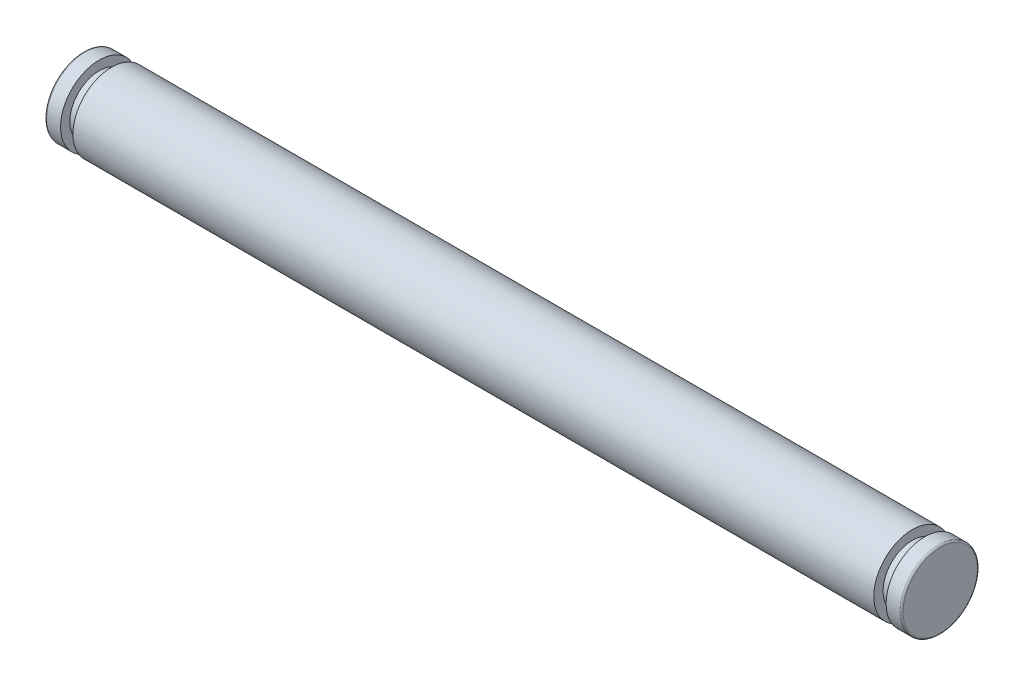
ISO-10303-21;
HEADER;
FILE_DESCRIPTION(('STEP AP214'),'2;1');
FILE_NAME('part.step','',(''),(''),'','','');
FILE_SCHEMA(('AUTOMOTIVE_DESIGN { 1 0 10303 214 1 1 1 1 }'));
ENDSEC;
DATA;
#1=APPLICATION_CONTEXT('core data for automotive mechanical design processes');
#2=APPLICATION_PROTOCOL_DEFINITION('international standard','automotive_design',2000,#1);
#3=PRODUCT_CONTEXT('',#1,'mechanical');
#4=PRODUCT('Part','Part','',(#3));
#5=PRODUCT_RELATED_PRODUCT_CATEGORY('part','',(#4));
#6=PRODUCT_DEFINITION_FORMATION('','',#4);
#7=PRODUCT_DEFINITION_CONTEXT('part definition',#1,'design');
#8=PRODUCT_DEFINITION('design','',#6,#7);
#9=PRODUCT_DEFINITION_SHAPE('','',#8);
#10=(LENGTH_UNIT() NAMED_UNIT(*) SI_UNIT(.MILLI.,.METRE.));
#11=(NAMED_UNIT(*) PLANE_ANGLE_UNIT() SI_UNIT($,.RADIAN.));
#12=(NAMED_UNIT(*) SI_UNIT($,.STERADIAN.) SOLID_ANGLE_UNIT());
#13=UNCERTAINTY_MEASURE_WITH_UNIT(LENGTH_MEASURE(1.E-05),#10,'distance_accuracy_value','');
#14=(GEOMETRIC_REPRESENTATION_CONTEXT(3) GLOBAL_UNCERTAINTY_ASSIGNED_CONTEXT((#13)) GLOBAL_UNIT_ASSIGNED_CONTEXT((#10,
#11,#12)) REPRESENTATION_CONTEXT('',''));
#15=CARTESIAN_POINT('',(0.,0.,0.));
#16=DIRECTION('',(0.,0.,1.));
#17=DIRECTION('',(1.,0.,0.));
#18=AXIS2_PLACEMENT_3D('',#15,#16,#17);
#19=CARTESIAN_POINT('',(0.,-1.542288,1.542288));
#20=DIRECTION('',(1.,0.,0.));
#21=DIRECTION('',(0.,0.,-1.));
#22=AXIS2_PLACEMENT_3D('',#19,#20,#21);
#23=PLANE('',#22);
#24=CARTESIAN_POINT('',(4.05862416325985E-10,0.,-1.52399999998335));
#25=CARTESIAN_POINT('',(4.05862415753623E-10,3.04799999996697,-1.52399999998335));
#26=CARTESIAN_POINT('',(4.05862415753623E-10,3.04799999996697,1.52399999998335));
#27=CARTESIAN_POINT('',(4.05862416325985E-10,0.,1.52399999998335));
#28=(BOUNDED_CURVE() B_SPLINE_CURVE(3,(#24,#25,#26,#27),.UNSPECIFIED.,.F.,
.F.) B_SPLINE_CURVE_WITH_KNOTS((4,4),(0.,1.),
.UNSPECIFIED.) CURVE() GEOMETRIC_REPRESENTATION_ITEM() RATIONAL_B_SPLINE_CURVE((0.956578302156102,
0.318859434052034,0.318859434052034,0.956578302156102)) REPRESENTATION_ITEM(''));
#29=CARTESIAN_POINT('',(2.43517449856769E-10,0.,-1.52399999968733));
#30=VERTEX_POINT('',#29);
#31=CARTESIAN_POINT('',(2.43517449856769E-10,0.,1.52399999968733));
#32=VERTEX_POINT('',#31);
#33=EDGE_CURVE('E55',#30,#32,#28,.T.);
#34=ORIENTED_EDGE('',*,*,#33,.F.);
#35=CARTESIAN_POINT('',(4.05862416363426E-10,0.,1.52399999998335));
#36=CARTESIAN_POINT('',(4.05862415812031E-10,-3.04799999996697,1.52399999998335));
#37=CARTESIAN_POINT('',(4.05862415812031E-10,-3.04799999996697,-1.52399999998335));
#38=CARTESIAN_POINT('',(4.05862416363426E-10,0.,-1.52399999998335));
#39=(BOUNDED_CURVE() B_SPLINE_CURVE(3,(#35,#36,#37,#38),.UNSPECIFIED.,.F.,
.F.) B_SPLINE_CURVE_WITH_KNOTS((4,4),(0.,1.),
.UNSPECIFIED.) CURVE() GEOMETRIC_REPRESENTATION_ITEM() RATIONAL_B_SPLINE_CURVE((0.956578302156103,
0.318859434052034,0.318859434052034,0.956578302156103)) REPRESENTATION_ITEM(''));
#40=EDGE_CURVE('E61',#32,#30,#39,.T.);
#41=ORIENTED_EDGE('',*,*,#40,.F.);
#42=EDGE_LOOP('',(#34,#41));
#43=FACE_BOUND('',#42,.T.);
#44=ADVANCED_FACE('F17',(#43),#23,.F.);
#45=CARTESIAN_POINT('',(0.069839422,0.,-1.587182764));
#46=CARTESIAN_POINT('',(0.069839422,3.174365529,-1.587182764));
#47=CARTESIAN_POINT('',(0.069839422,3.174365529,1.587182764));
#48=CARTESIAN_POINT('',(0.069839422,0.,1.587182764));
#49=CARTESIAN_POINT('',(0.026666586,0.,-1.591514497));
#50=CARTESIAN_POINT('',(0.026666586,3.183028994,-1.591514497));
#51=CARTESIAN_POINT('',(0.026666586,3.183028994,1.591514497));
#52=CARTESIAN_POINT('',(0.026666586,0.,1.591514497));
#53=CARTESIAN_POINT('',(-0.004014497,0.,-1.560833414));
#54=CARTESIAN_POINT('',(-0.004014497,3.121666828,-1.560833414));
#55=CARTESIAN_POINT('',(-0.004014497,3.121666828,1.560833414));
#56=CARTESIAN_POINT('',(-0.004014497,0.,1.560833414));
#57=CARTESIAN_POINT('',(0.000317236,0.,-1.517660578));
#58=CARTESIAN_POINT('',(0.000317236,3.035321156,-1.517660578));
#59=CARTESIAN_POINT('',(0.000317236,3.035321156,1.517660578));
#60=CARTESIAN_POINT('',(0.000317236,0.,1.517660578));
#61=(BOUNDED_SURFACE() B_SPLINE_SURFACE(3,3,((#45,#46,#47,#48),(#49,#50,#51,#52),(#53,#54,#55,
#56),(#57,#58,#59,#60)),.UNSPECIFIED.,.F.,.F.,.F.) B_SPLINE_SURFACE_WITH_KNOTS((4,4),(4,4),(0.,
1.),(0.,1.),.UNSPECIFIED.) GEOMETRIC_REPRESENTATION_ITEM() RATIONAL_B_SPLINE_SURFACE(((1.,
0.333333333333333,0.333333333333333,1.),(0.755320871117972,0.251773623705991,0.251773623705991,
0.755320871117972),(0.755320871117972,0.251773623705991,0.251773623705991,0.755320871117972),
(1.,0.333333333333333,0.333333333333333,1.))) REPRESENTATION_ITEM('') SURFACE());
#62=CARTESIAN_POINT('',(0.0635000000000011,0.,0.));
#63=DIRECTION('',(-1.,0.,0.));
#64=DIRECTION('',(0.,0.,1.));
#65=AXIS2_PLACEMENT_3D('',#62,#63,#64);
#66=CIRCLE('',#65,1.5875);
#67=CARTESIAN_POINT('',(0.0635000000045585,-1.42547385130614E-10,1.58749999989853));
#68=VERTEX_POINT('',#67);
#69=CARTESIAN_POINT('',(0.0635000000045585,-4.88402539152132E-10,-1.58749999989853));
#70=VERTEX_POINT('',#69);
#71=EDGE_CURVE('E71',#68,#70,#66,.T.);
#72=CARTESIAN_POINT('',(0.069839422,0.,-1.587182764));
#73=CARTESIAN_POINT('',(0.026666586,0.,-1.591514497));
#74=CARTESIAN_POINT('',(-0.004014497,0.,-1.560833414));
#75=CARTESIAN_POINT('',(0.000317236,0.,-1.517660578));
#76=(BOUNDED_CURVE() B_SPLINE_CURVE(3,(#72,#73,#74,#75),.UNSPECIFIED.,.F.,
.F.) B_SPLINE_CURVE_WITH_KNOTS((4,4),(0.,1.),
.UNSPECIFIED.) CURVE() GEOMETRIC_REPRESENTATION_ITEM() RATIONAL_B_SPLINE_CURVE((1.,
0.755320871117972,0.755320871117972,1.)) REPRESENTATION_ITEM(''));
#77=EDGE_CURVE('E68',#30,#70,#76,.F.);
#78=CARTESIAN_POINT('',(0.069839422,0.,1.587182764));
#79=CARTESIAN_POINT('',(0.026666586,0.,1.591514497));
#80=CARTESIAN_POINT('',(-0.004014497,0.,1.560833414));
#81=CARTESIAN_POINT('',(0.000317236,0.,1.517660578));
#82=(BOUNDED_CURVE() B_SPLINE_CURVE(3,(#78,#79,#80,#81),.UNSPECIFIED.,.F.,
.F.) B_SPLINE_CURVE_WITH_KNOTS((4,4),(0.,1.),
.UNSPECIFIED.) CURVE() GEOMETRIC_REPRESENTATION_ITEM() RATIONAL_B_SPLINE_CURVE((1.,
0.755320871117972,0.755320871117972,1.)) REPRESENTATION_ITEM(''));
#83=EDGE_CURVE('E64',#68,#32,#82,.T.);
#84=ORIENTED_EDGE('',*,*,#71,.T.);
#85=ORIENTED_EDGE('',*,*,#77,.F.);
#86=ORIENTED_EDGE('',*,*,#33,.T.);
#87=ORIENTED_EDGE('',*,*,#83,.F.);
#88=EDGE_LOOP('',(#84,#85,#86,#87));
#89=FACE_BOUND('',#88,.T.);
#90=ADVANCED_FACE('F69',(#89),#61,.T.);
#91=CARTESIAN_POINT('',(0.069839422,0.,1.587182764));
#92=CARTESIAN_POINT('',(0.069839422,-3.174365529,1.587182764));
#93=CARTESIAN_POINT('',(0.069839422,-3.174365529,-1.587182764));
#94=CARTESIAN_POINT('',(0.069839422,0.,-1.587182764));
#95=CARTESIAN_POINT('',(0.026666586,0.,1.591514497));
#96=CARTESIAN_POINT('',(0.026666586,-3.183028994,1.591514497));
#97=CARTESIAN_POINT('',(0.026666586,-3.183028994,-1.591514497));
#98=CARTESIAN_POINT('',(0.026666586,0.,-1.591514497));
#99=CARTESIAN_POINT('',(-0.004014497,0.,1.560833414));
#100=CARTESIAN_POINT('',(-0.004014497,-3.121666828,1.560833414));
#101=CARTESIAN_POINT('',(-0.004014497,-3.121666828,-1.560833414));
#102=CARTESIAN_POINT('',(-0.004014497,0.,-1.560833414));
#103=CARTESIAN_POINT('',(0.000317236,0.,1.517660578));
#104=CARTESIAN_POINT('',(0.000317236,-3.035321156,1.517660578));
#105=CARTESIAN_POINT('',(0.000317236,-3.035321156,-1.517660578));
#106=CARTESIAN_POINT('',(0.000317236,0.,-1.517660578));
#107=(BOUNDED_SURFACE() B_SPLINE_SURFACE(3,3,((#91,#92,#93,#94),(#95,#96,#97,#98),(#99,#100,
#101,#102),(#103,#104,#105,#106)),.UNSPECIFIED.,.F.,.F.,.F.) B_SPLINE_SURFACE_WITH_KNOTS((4,4),
(4,4),(0.,1.),(0.,1.),
.UNSPECIFIED.) GEOMETRIC_REPRESENTATION_ITEM() RATIONAL_B_SPLINE_SURFACE(((1.,0.333333333333333,
0.333333333333333,1.),(0.755320871117972,0.251773623705991,0.251773623705991,0.755320871117972),
(0.755320871117972,0.251773623705991,0.251773623705991,0.755320871117972),(1.,0.333333333333333,
0.333333333333333,1.))) REPRESENTATION_ITEM('') SURFACE());
#108=CARTESIAN_POINT('',(0.0635000000000011,0.,0.));
#109=DIRECTION('',(-1.,0.,0.));
#110=DIRECTION('',(0.,0.,1.));
#111=AXIS2_PLACEMENT_3D('',#108,#109,#110);
#112=CIRCLE('',#111,1.5875);
#113=EDGE_CURVE('E192',#70,#68,#112,.T.);
#114=ORIENTED_EDGE('',*,*,#77,.T.);
#115=ORIENTED_EDGE('',*,*,#113,.T.);
#116=ORIENTED_EDGE('',*,*,#83,.T.);
#117=ORIENTED_EDGE('',*,*,#40,.T.);
#118=EDGE_LOOP('',(#114,#115,#116,#117));
#119=FACE_BOUND('',#118,.T.);
#120=ADVANCED_FACE('F77',(#119),#107,.T.);
#121=CARTESIAN_POINT('',(0.635,0.,0.));
#122=DIRECTION('',(-1.,0.,0.));
#123=DIRECTION('',(0.,0.,1.));
#124=AXIS2_PLACEMENT_3D('',#121,#122,#123);
#125=CYLINDRICAL_SURFACE('',#124,1.5875);
#126=CARTESIAN_POINT('',(0.634999999999997,0.,0.));
#127=DIRECTION('',(-1.,0.,0.));
#128=DIRECTION('',(0.,0.,1.));
#129=AXIS2_PLACEMENT_3D('',#126,#127,#128);
#130=CIRCLE('',#129,1.5875);
#131=CARTESIAN_POINT('',(0.634999999999997,0.,1.5875));
#132=VERTEX_POINT('',#131);
#133=EDGE_CURVE('E21',#132,#132,#130,.T.);
#134=ORIENTED_EDGE('',*,*,#133,.T.);
#135=EDGE_LOOP('',(#134));
#136=FACE_BOUND('',#135,.T.);
#137=ORIENTED_EDGE('',*,*,#71,.F.);
#138=ORIENTED_EDGE('',*,*,#113,.F.);
#139=EDGE_LOOP('',(#137,#138));
#140=FACE_BOUND('',#139,.T.);
#141=ADVANCED_FACE('F98',(#136,#140),#125,.T.);
#142=CARTESIAN_POINT('',(0.635,-1.60655,-1.60655));
#143=DIRECTION('',(-1.,0.,0.));
#144=DIRECTION('',(0.,0.,1.));
#145=AXIS2_PLACEMENT_3D('',#142,#143,#144);
#146=PLANE('',#145);
#147=CARTESIAN_POINT('',(0.635000000000004,0.,0.));
#148=DIRECTION('',(1.,0.,0.));
#149=DIRECTION('',(0.,0.,-1.));
#150=AXIS2_PLACEMENT_3D('',#147,#148,#149);
#151=CIRCLE('',#150,1.2065);
#152=CARTESIAN_POINT('',(0.635000000000004,0.,-1.2065));
#153=VERTEX_POINT('',#152);
#154=EDGE_CURVE('E187',#153,#153,#151,.F.);
#155=ORIENTED_EDGE('',*,*,#154,.T.);
#156=EDGE_LOOP('',(#155));
#157=FACE_BOUND('',#156,.T.);
#158=ORIENTED_EDGE('',*,*,#133,.F.);
#159=EDGE_LOOP('',(#158));
#160=FACE_BOUND('',#159,.T.);
#161=ADVANCED_FACE('F125',(#157,#160),#146,.F.);
#162=CARTESIAN_POINT('',(0.635,0.,0.));
#163=DIRECTION('',(1.,0.,0.));
#164=DIRECTION('',(0.,0.,-1.));
#165=AXIS2_PLACEMENT_3D('',#162,#163,#164);
#166=CYLINDRICAL_SURFACE('',#165,1.2065);
#167=CARTESIAN_POINT('',(1.143,0.,0.));
#168=DIRECTION('',(1.,0.,0.));
#169=DIRECTION('',(0.,0.,-1.));
#170=AXIS2_PLACEMENT_3D('',#167,#168,#169);
#171=CIRCLE('',#170,1.2065);
#172=CARTESIAN_POINT('',(1.143,0.,-1.2065));
#173=VERTEX_POINT('',#172);
#174=EDGE_CURVE('E185',#173,#173,#171,.F.);
#175=ORIENTED_EDGE('',*,*,#174,.T.);
#176=EDGE_LOOP('',(#175));
#177=FACE_BOUND('',#176,.T.);
#178=ORIENTED_EDGE('',*,*,#154,.F.);
#179=EDGE_LOOP('',(#178));
#180=FACE_BOUND('',#179,.T.);
#181=ADVANCED_FACE('F258',(#177,#180),#166,.T.);
#182=CARTESIAN_POINT('',(1.143,-1.60655,1.60655));
#183=DIRECTION('',(1.,0.,0.));
#184=DIRECTION('',(0.,0.,-1.));
#185=AXIS2_PLACEMENT_3D('',#182,#183,#184);
#186=PLANE('',#185);
#187=ORIENTED_EDGE('',*,*,#174,.F.);
#188=EDGE_LOOP('',(#187));
#189=FACE_BOUND('',#188,.T.);
#190=CARTESIAN_POINT('',(1.143,0.,0.));
#191=DIRECTION('',(-1.,0.,0.));
#192=DIRECTION('',(0.,0.,1.));
#193=AXIS2_PLACEMENT_3D('',#190,#191,#192);
#194=CIRCLE('',#193,1.5875);
#195=CARTESIAN_POINT('',(1.143,0.,1.5875));
#196=VERTEX_POINT('',#195);
#197=EDGE_CURVE('E182',#196,#196,#194,.T.);
#198=ORIENTED_EDGE('',*,*,#197,.T.);
#199=EDGE_LOOP('',(#198));
#200=FACE_BOUND('',#199,.T.);
#201=ADVANCED_FACE('F256',(#189,#200),#186,.F.);
#202=CARTESIAN_POINT('',(34.02584,0.,0.));
#203=DIRECTION('',(-1.,0.,0.));
#204=DIRECTION('',(0.,0.,1.));
#205=AXIS2_PLACEMENT_3D('',#202,#203,#204);
#206=CYLINDRICAL_SURFACE('',#205,1.5875);
#207=CARTESIAN_POINT('',(34.02584,0.,0.));
#208=DIRECTION('',(-1.,0.,0.));
#209=DIRECTION('',(0.,0.,1.));
#210=AXIS2_PLACEMENT_3D('',#207,#208,#209);
#211=CIRCLE('',#210,1.5875);
#212=CARTESIAN_POINT('',(34.02584,0.,1.5875));
#213=VERTEX_POINT('',#212);
#214=EDGE_CURVE('E178',#213,#213,#211,.T.);
#215=ORIENTED_EDGE('',*,*,#214,.T.);
#216=EDGE_LOOP('',(#215));
#217=FACE_BOUND('',#216,.T.);
#218=ORIENTED_EDGE('',*,*,#197,.F.);
#219=EDGE_LOOP('',(#218));
#220=FACE_BOUND('',#219,.T.);
#221=ADVANCED_FACE('F249',(#217,#220),#206,.T.);
#222=CARTESIAN_POINT('',(34.02584,-1.60655,-1.60655));
#223=DIRECTION('',(-1.,0.,0.));
#224=DIRECTION('',(0.,0.,1.));
#225=AXIS2_PLACEMENT_3D('',#222,#223,#224);
#226=PLANE('',#225);
#227=CARTESIAN_POINT('',(34.02584,0.,0.));
#228=DIRECTION('',(1.,0.,0.));
#229=DIRECTION('',(0.,0.,-1.));
#230=AXIS2_PLACEMENT_3D('',#227,#228,#229);
#231=CIRCLE('',#230,1.2065);
#232=CARTESIAN_POINT('',(34.02584,0.,-1.2065));
#233=VERTEX_POINT('',#232);
#234=EDGE_CURVE('E174',#233,#233,#231,.F.);
#235=ORIENTED_EDGE('',*,*,#234,.T.);
#236=EDGE_LOOP('',(#235));
#237=FACE_BOUND('',#236,.T.);
#238=ORIENTED_EDGE('',*,*,#214,.F.);
#239=EDGE_LOOP('',(#238));
#240=FACE_BOUND('',#239,.T.);
#241=ADVANCED_FACE('F158',(#237,#240),#226,.F.);
#242=CARTESIAN_POINT('',(35.168522764,0.,1.517660578));
#243=CARTESIAN_POINT('',(35.168522764,-3.035321156,1.517660578));
#244=CARTESIAN_POINT('',(35.168522764,-3.035321156,-1.517660578));
#245=CARTESIAN_POINT('',(35.168522764,0.,-1.517660578));
#246=CARTESIAN_POINT('',(35.172854497,0.,1.560833414));
#247=CARTESIAN_POINT('',(35.172854497,-3.121666828,1.560833414));
#248=CARTESIAN_POINT('',(35.172854497,-3.121666828,-1.560833414));
#249=CARTESIAN_POINT('',(35.172854497,0.,-1.560833414));
#250=CARTESIAN_POINT('',(35.142173414,0.,1.591514497));
#251=CARTESIAN_POINT('',(35.142173414,-3.183028994,1.591514497));
#252=CARTESIAN_POINT('',(35.142173414,-3.183028994,-1.591514497));
#253=CARTESIAN_POINT('',(35.142173414,0.,-1.591514497));
#254=CARTESIAN_POINT('',(35.099000578,0.,1.587182764));
#255=CARTESIAN_POINT('',(35.099000578,-3.174365529,1.587182764));
#256=CARTESIAN_POINT('',(35.099000578,-3.174365529,-1.587182764));
#257=CARTESIAN_POINT('',(35.099000578,0.,-1.587182764));
#258=(BOUNDED_SURFACE() B_SPLINE_SURFACE(3,3,((#242,#243,#244,#245),(#246,#247,#248,#249),(#250,
#251,#252,#253),(#254,#255,#256,#257)),.UNSPECIFIED.,.F.,.F.,
.F.) B_SPLINE_SURFACE_WITH_KNOTS((4,4),(4,4),(0.,1.),(0.,1.),
.UNSPECIFIED.) GEOMETRIC_REPRESENTATION_ITEM() RATIONAL_B_SPLINE_SURFACE(((1.,0.333333333333333,
0.333333333333333,1.),(0.755320871117969,0.25177362370599,0.25177362370599,0.755320871117969),
(0.755320871117969,0.25177362370599,0.25177362370599,0.755320871117969),(1.,0.333333333333333,
0.333333333333333,1.))) REPRESENTATION_ITEM('') SURFACE());
#259=CARTESIAN_POINT('',(35.168522764,0.,-1.517660578));
#260=CARTESIAN_POINT('',(35.172854497,0.,-1.560833414));
#261=CARTESIAN_POINT('',(35.142173414,0.,-1.591514497));
#262=CARTESIAN_POINT('',(35.099000578,0.,-1.587182764));
#263=(BOUNDED_CURVE() B_SPLINE_CURVE(3,(#259,#260,#261,#262),.UNSPECIFIED.,.F.,
.F.) B_SPLINE_CURVE_WITH_KNOTS((4,4),(0.,1.),
.UNSPECIFIED.) CURVE() GEOMETRIC_REPRESENTATION_ITEM() RATIONAL_B_SPLINE_CURVE((1.,
0.755320871117969,0.755320871117969,1.)) REPRESENTATION_ITEM(''));
#264=CARTESIAN_POINT('',(35.1053399999954,-3.25601692788899E-10,-1.58749999989853));
#265=VERTEX_POINT('',#264);
#266=CARTESIAN_POINT('',(35.1688399997565,0.,-1.52399999968733));
#267=VERTEX_POINT('',#266);
#268=EDGE_CURVE('E36',#265,#267,#263,.F.);
#269=CARTESIAN_POINT('',(35.1688399995941,0.,-1.52399999998335));
#270=CARTESIAN_POINT('',(35.1688399995941,-3.04799999996697,-1.52399999998335));
#271=CARTESIAN_POINT('',(35.1688399995941,-3.04799999996697,1.52399999998335));
#272=CARTESIAN_POINT('',(35.1688399995941,0.,1.52399999998335));
#273=(BOUNDED_CURVE() B_SPLINE_CURVE(3,(#269,#270,#271,#272),.UNSPECIFIED.,.F.,
.F.) B_SPLINE_CURVE_WITH_KNOTS((4,4),(0.,1.),
.UNSPECIFIED.) CURVE() GEOMETRIC_REPRESENTATION_ITEM() RATIONAL_B_SPLINE_CURVE((0.956578302156104,
0.318859434052034,0.318859434052034,0.956578302156104)) REPRESENTATION_ITEM(''));
#274=CARTESIAN_POINT('',(35.1688399997565,0.,1.52399999968733));
#275=VERTEX_POINT('',#274);
#276=EDGE_CURVE('E173',#275,#267,#273,.F.);
#277=CARTESIAN_POINT('',(35.168522764,0.,1.517660578));
#278=CARTESIAN_POINT('',(35.172854497,0.,1.560833414));
#279=CARTESIAN_POINT('',(35.142173414,0.,1.591514497));
#280=CARTESIAN_POINT('',(35.099000578,0.,1.587182764));
#281=(BOUNDED_CURVE() B_SPLINE_CURVE(3,(#277,#278,#279,#280),.UNSPECIFIED.,.F.,
.F.) B_SPLINE_CURVE_WITH_KNOTS((4,4),(0.,1.),
.UNSPECIFIED.) CURVE() GEOMETRIC_REPRESENTATION_ITEM() RATIONAL_B_SPLINE_CURVE((1.,
0.755320871117969,0.755320871117969,1.)) REPRESENTATION_ITEM(''));
#282=CARTESIAN_POINT('',(35.1053399999954,-1.42547385130614E-10,1.58749999989853));
#283=VERTEX_POINT('',#282);
#284=EDGE_CURVE('E181',#275,#283,#281,.T.);
#285=CARTESIAN_POINT('',(35.10534,0.,0.));
#286=DIRECTION('',(-1.,0.,0.));
#287=DIRECTION('',(0.,0.,1.));
#288=AXIS2_PLACEMENT_3D('',#285,#286,#287);
#289=CIRCLE('',#288,1.5875);
#290=EDGE_CURVE('E177',#283,#265,#289,.F.);
#291=ORIENTED_EDGE('',*,*,#268,.T.);
#292=ORIENTED_EDGE('',*,*,#276,.F.);
#293=ORIENTED_EDGE('',*,*,#284,.T.);
#294=ORIENTED_EDGE('',*,*,#290,.T.);
#295=EDGE_LOOP('',(#291,#292,#293,#294));
#296=FACE_BOUND('',#295,.T.);
#297=ADVANCED_FACE('F236',(#296),#258,.T.);
#298=CARTESIAN_POINT('',(34.02584,0.,0.));
#299=DIRECTION('',(1.,0.,0.));
#300=DIRECTION('',(0.,0.,-1.));
#301=AXIS2_PLACEMENT_3D('',#298,#299,#300);
#302=CYLINDRICAL_SURFACE('',#301,1.2065);
#303=CARTESIAN_POINT('',(34.53384,0.,0.));
#304=DIRECTION('',(1.,0.,0.));
#305=DIRECTION('',(0.,0.,-1.));
#306=AXIS2_PLACEMENT_3D('',#303,#304,#305);
#307=CIRCLE('',#306,1.2065);
#308=CARTESIAN_POINT('',(34.53384,0.,-1.2065));
#309=VERTEX_POINT('',#308);
#310=EDGE_CURVE('E170',#309,#309,#307,.F.);
#311=ORIENTED_EDGE('',*,*,#310,.T.);
#312=EDGE_LOOP('',(#311));
#313=FACE_BOUND('',#312,.T.);
#314=ORIENTED_EDGE('',*,*,#234,.F.);
#315=EDGE_LOOP('',(#314));
#316=FACE_BOUND('',#315,.T.);
#317=ADVANCED_FACE('F157',(#313,#316),#302,.T.);
#318=CARTESIAN_POINT('',(35.16884,-1.542288,1.542288));
#319=DIRECTION('',(1.,0.,0.));
#320=DIRECTION('',(0.,0.,-1.));
#321=AXIS2_PLACEMENT_3D('',#318,#319,#320);
#322=PLANE('',#321);
#323=CARTESIAN_POINT('',(35.1688399995941,0.,1.52399999998335));
#324=CARTESIAN_POINT('',(35.1688399995941,3.04799999996697,1.52399999998335));
#325=CARTESIAN_POINT('',(35.1688399995941,3.04799999996697,-1.52399999998335));
#326=CARTESIAN_POINT('',(35.1688399995941,0.,-1.52399999998335));
#327=(BOUNDED_CURVE() B_SPLINE_CURVE(3,(#323,#324,#325,#326),.UNSPECIFIED.,.F.,
.F.) B_SPLINE_CURVE_WITH_KNOTS((4,4),(0.,1.),
.UNSPECIFIED.) CURVE() GEOMETRIC_REPRESENTATION_ITEM() RATIONAL_B_SPLINE_CURVE((0.956578302156104,
0.318859434052034,0.318859434052034,0.956578302156104)) REPRESENTATION_ITEM(''));
#328=EDGE_CURVE('E143',#275,#267,#327,.T.);
#329=ORIENTED_EDGE('',*,*,#328,.F.);
#330=ORIENTED_EDGE('',*,*,#276,.T.);
#331=EDGE_LOOP('',(#329,#330));
#332=FACE_BOUND('',#331,.T.);
#333=ADVANCED_FACE('F148',(#332),#322,.T.);
#334=CARTESIAN_POINT('',(34.53384,-1.60655,1.60655));
#335=DIRECTION('',(1.,0.,0.));
#336=DIRECTION('',(0.,0.,-1.));
#337=AXIS2_PLACEMENT_3D('',#334,#335,#336);
#338=PLANE('',#337);
#339=ORIENTED_EDGE('',*,*,#310,.F.);
#340=EDGE_LOOP('',(#339));
#341=FACE_BOUND('',#340,.T.);
#342=CARTESIAN_POINT('',(34.53384,0.,0.));
#343=DIRECTION('',(-1.,0.,0.));
#344=DIRECTION('',(0.,0.,1.));
#345=AXIS2_PLACEMENT_3D('',#342,#343,#344);
#346=CIRCLE('',#345,1.5875);
#347=CARTESIAN_POINT('',(34.53384,0.,1.5875));
#348=VERTEX_POINT('',#347);
#349=EDGE_CURVE('E27',#348,#348,#346,.T.);
#350=ORIENTED_EDGE('',*,*,#349,.T.);
#351=EDGE_LOOP('',(#350));
#352=FACE_BOUND('',#351,.T.);
#353=ADVANCED_FACE('F19',(#341,#352),#338,.F.);
#354=CARTESIAN_POINT('',(35.168522764,0.,-1.517660578));
#355=CARTESIAN_POINT('',(35.168522764,3.035321156,-1.517660578));
#356=CARTESIAN_POINT('',(35.168522764,3.035321156,1.517660578));
#357=CARTESIAN_POINT('',(35.168522764,0.,1.517660578));
#358=CARTESIAN_POINT('',(35.172854497,0.,-1.560833414));
#359=CARTESIAN_POINT('',(35.172854497,3.121666828,-1.560833414));
#360=CARTESIAN_POINT('',(35.172854497,3.121666828,1.560833414));
#361=CARTESIAN_POINT('',(35.172854497,0.,1.560833414));
#362=CARTESIAN_POINT('',(35.142173414,0.,-1.591514497));
#363=CARTESIAN_POINT('',(35.142173414,3.183028994,-1.591514497));
#364=CARTESIAN_POINT('',(35.142173414,3.183028994,1.591514497));
#365=CARTESIAN_POINT('',(35.142173414,0.,1.591514497));
#366=CARTESIAN_POINT('',(35.099000578,0.,-1.587182764));
#367=CARTESIAN_POINT('',(35.099000578,3.174365529,-1.587182764));
#368=CARTESIAN_POINT('',(35.099000578,3.174365529,1.587182764));
#369=CARTESIAN_POINT('',(35.099000578,0.,1.587182764));
#370=(BOUNDED_SURFACE() B_SPLINE_SURFACE(3,3,((#354,#355,#356,#357),(#358,#359,#360,#361),(#362,
#363,#364,#365),(#366,#367,#368,#369)),.UNSPECIFIED.,.F.,.F.,
.F.) B_SPLINE_SURFACE_WITH_KNOTS((4,4),(4,4),(0.,1.),(0.,1.),
.UNSPECIFIED.) GEOMETRIC_REPRESENTATION_ITEM() RATIONAL_B_SPLINE_SURFACE(((1.,0.333333333333333,
0.333333333333333,1.),(0.755320871117969,0.25177362370599,0.25177362370599,0.755320871117969),
(0.755320871117969,0.25177362370599,0.25177362370599,0.755320871117969),(1.,0.333333333333333,
0.333333333333333,1.))) REPRESENTATION_ITEM('') SURFACE());
#371=CARTESIAN_POINT('',(35.10534,0.,0.));
#372=DIRECTION('',(-1.,0.,0.));
#373=DIRECTION('',(0.,0.,1.));
#374=AXIS2_PLACEMENT_3D('',#371,#372,#373);
#375=CIRCLE('',#374,1.5875);
#376=EDGE_CURVE('E11',#265,#283,#375,.F.);
#377=ORIENTED_EDGE('',*,*,#328,.T.);
#378=ORIENTED_EDGE('',*,*,#268,.F.);
#379=ORIENTED_EDGE('',*,*,#376,.T.);
#380=ORIENTED_EDGE('',*,*,#284,.F.);
#381=EDGE_LOOP('',(#377,#378,#379,#380));
#382=FACE_BOUND('',#381,.T.);
#383=ADVANCED_FACE('F270',(#382),#370,.T.);
#384=CARTESIAN_POINT('',(35.10534,0.,0.));
#385=DIRECTION('',(-1.,0.,0.));
#386=DIRECTION('',(0.,0.,1.));
#387=AXIS2_PLACEMENT_3D('',#384,#385,#386);
#388=CYLINDRICAL_SURFACE('',#387,1.5875);
#389=ORIENTED_EDGE('',*,*,#290,.F.);
#390=ORIENTED_EDGE('',*,*,#376,.F.);
#391=EDGE_LOOP('',(#389,#390));
#392=FACE_BOUND('',#391,.T.);
#393=ORIENTED_EDGE('',*,*,#349,.F.);
#394=EDGE_LOOP('',(#393));
#395=FACE_BOUND('',#394,.T.);
#396=ADVANCED_FACE('F268',(#392,#395),#388,.T.);
#397=CLOSED_SHELL('',(#44,#90,#120,#141,#161,#181,#201,#221,#241,#297,#317,#333,#353,#383,#396));
#398=MANIFOLD_SOLID_BREP('B1',#397);
#399=ADVANCED_BREP_SHAPE_REPRESENTATION('',(#18,#398),#14);
#400=SHAPE_DEFINITION_REPRESENTATION(#9,#399);
ENDSEC;
END-ISO-10303-21;
